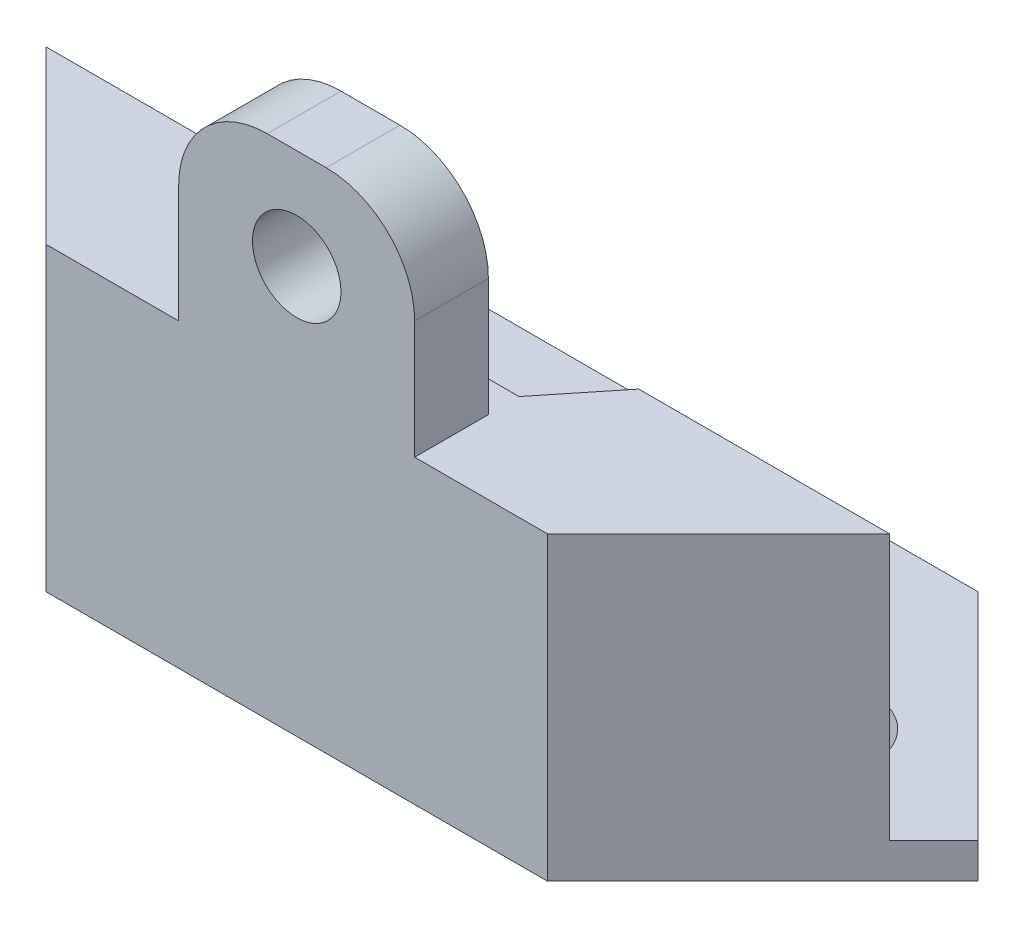
ISO-10303-21;
HEADER;
FILE_DESCRIPTION(('STEP AP214'),'2;1');
FILE_NAME('part.step','',(''),(''),'','','');
FILE_SCHEMA(('AUTOMOTIVE_DESIGN { 1 0 10303 214 1 1 1 1 }'));
ENDSEC;
DATA;
#1=APPLICATION_CONTEXT('core data for automotive mechanical design processes');
#2=APPLICATION_PROTOCOL_DEFINITION('international standard','automotive_design',2000,#1);
#3=PRODUCT_CONTEXT('',#1,'mechanical');
#4=PRODUCT('Part','Part','',(#3));
#5=PRODUCT_RELATED_PRODUCT_CATEGORY('part','',(#4));
#6=PRODUCT_DEFINITION_FORMATION('','',#4);
#7=PRODUCT_DEFINITION_CONTEXT('part definition',#1,'design');
#8=PRODUCT_DEFINITION('design','',#6,#7);
#9=PRODUCT_DEFINITION_SHAPE('','',#8);
#10=(LENGTH_UNIT() NAMED_UNIT(*) SI_UNIT(.MILLI.,.METRE.));
#11=(NAMED_UNIT(*) PLANE_ANGLE_UNIT() SI_UNIT($,.RADIAN.));
#12=(NAMED_UNIT(*) SI_UNIT($,.STERADIAN.) SOLID_ANGLE_UNIT());
#13=UNCERTAINTY_MEASURE_WITH_UNIT(LENGTH_MEASURE(1.E-05),#10,'distance_accuracy_value','');
#14=(GEOMETRIC_REPRESENTATION_CONTEXT(3) GLOBAL_UNCERTAINTY_ASSIGNED_CONTEXT((#13)) GLOBAL_UNIT_ASSIGNED_CONTEXT((#10,
#11,#12)) REPRESENTATION_CONTEXT('',''));
#15=CARTESIAN_POINT('',(0.,0.,0.));
#16=DIRECTION('',(0.,0.,1.));
#17=DIRECTION('',(1.,0.,0.));
#18=AXIS2_PLACEMENT_3D('',#15,#16,#17);
#19=CARTESIAN_POINT('',(-0.999999999999999,14.2,4.8));
#20=DIRECTION('',(0.,0.,1.));
#21=DIRECTION('',(1.,0.,0.));
#22=AXIS2_PLACEMENT_3D('',#19,#20,#21);
#23=CYLINDRICAL_SURFACE('',#22,3.);
#24=DIRECTION('',(0.,0.,-1.));
#25=VECTOR('',#24,1.);
#26=CARTESIAN_POINT('',(-4.,14.2,4.8));
#27=LINE('',#26,#25);
#28=CARTESIAN_POINT('',(-4.,14.2,7.3));
#29=VERTEX_POINT('',#28);
#30=CARTESIAN_POINT('',(-4.,14.2,4.8));
#31=VERTEX_POINT('',#30);
#32=EDGE_CURVE('E336',#29,#31,#27,.T.);
#33=ORIENTED_EDGE('',*,*,#32,.F.);
#34=CARTESIAN_POINT('',(-0.999999999999999,14.2,7.3));
#35=DIRECTION('',(0.,0.,-1.));
#36=DIRECTION('',(-1.,0.,0.));
#37=AXIS2_PLACEMENT_3D('',#34,#35,#36);
#38=CIRCLE('',#37,3.);
#39=CARTESIAN_POINT('',(-0.999999999999999,17.2,7.3));
#40=VERTEX_POINT('',#39);
#41=EDGE_CURVE('E41',#40,#29,#38,.F.);
#42=ORIENTED_EDGE('',*,*,#41,.F.);
#43=DIRECTION('',(0.,0.,-1.));
#44=VECTOR('',#43,1.);
#45=CARTESIAN_POINT('',(-0.999999999999999,17.2,4.8));
#46=LINE('',#45,#44);
#47=CARTESIAN_POINT('',(-0.999999999999999,17.2,4.8));
#48=VERTEX_POINT('',#47);
#49=EDGE_CURVE('E339',#48,#40,#46,.F.);
#50=ORIENTED_EDGE('',*,*,#49,.F.);
#51=CARTESIAN_POINT('',(-0.999999999999999,14.2,4.8));
#52=DIRECTION('',(0.,0.,1.));
#53=DIRECTION('',(1.,0.,0.));
#54=AXIS2_PLACEMENT_3D('',#51,#52,#53);
#55=CIRCLE('',#54,3.);
#56=EDGE_CURVE('E11',#31,#48,#55,.F.);
#57=ORIENTED_EDGE('',*,*,#56,.F.);
#58=EDGE_LOOP('',(#33,#42,#50,#57));
#59=FACE_BOUND('',#58,.T.);
#60=ADVANCED_FACE('F34',(#59),#23,.T.);
#61=CARTESIAN_POINT('',(1.,14.2,4.8));
#62=DIRECTION('',(0.,0.,-1.));
#63=DIRECTION('',(-1.,0.,0.));
#64=AXIS2_PLACEMENT_3D('',#61,#62,#63);
#65=CYLINDRICAL_SURFACE('',#64,3.);
#66=DIRECTION('',(0.,0.,1.));
#67=VECTOR('',#66,1.);
#68=CARTESIAN_POINT('',(4.,14.2,4.8));
#69=LINE('',#68,#67);
#70=CARTESIAN_POINT('',(4.,14.2,4.8));
#71=VERTEX_POINT('',#70);
#72=CARTESIAN_POINT('',(4.,14.2,7.3));
#73=VERTEX_POINT('',#72);
#74=EDGE_CURVE('E324',#71,#73,#69,.T.);
#75=ORIENTED_EDGE('',*,*,#74,.F.);
#76=CARTESIAN_POINT('',(1.,14.2,4.8));
#77=DIRECTION('',(0.,0.,1.));
#78=DIRECTION('',(1.,0.,0.));
#79=AXIS2_PLACEMENT_3D('',#76,#77,#78);
#80=CIRCLE('',#79,3.);
#81=CARTESIAN_POINT('',(1.,17.2,4.8));
#82=VERTEX_POINT('',#81);
#83=EDGE_CURVE('E331',#82,#71,#80,.F.);
#84=ORIENTED_EDGE('',*,*,#83,.F.);
#85=DIRECTION('',(0.,0.,1.));
#86=VECTOR('',#85,1.);
#87=CARTESIAN_POINT('',(1.,17.2,4.8));
#88=LINE('',#87,#86);
#89=CARTESIAN_POINT('',(1.,17.2,7.3));
#90=VERTEX_POINT('',#89);
#91=EDGE_CURVE('E327',#90,#82,#88,.F.);
#92=ORIENTED_EDGE('',*,*,#91,.F.);
#93=CARTESIAN_POINT('',(1.,14.2,7.3));
#94=DIRECTION('',(0.,0.,-1.));
#95=DIRECTION('',(-1.,0.,0.));
#96=AXIS2_PLACEMENT_3D('',#93,#94,#95);
#97=CIRCLE('',#96,3.);
#98=EDGE_CURVE('E333',#73,#90,#97,.F.);
#99=ORIENTED_EDGE('',*,*,#98,.F.);
#100=EDGE_LOOP('',(#75,#84,#92,#99));
#101=FACE_BOUND('',#100,.T.);
#102=ADVANCED_FACE('F404',(#101),#65,.T.);
#103=CARTESIAN_POINT('',(-14.3000000000001,10.2,1.5));
#104=DIRECTION('',(0.,0.,1.));
#105=DIRECTION('',(1.,0.,0.));
#106=AXIS2_PLACEMENT_3D('',#103,#104,#105);
#107=PLANE('',#106);
#108=CARTESIAN_POINT('',(-9.75000000000006,6.7,1.5));
#109=DIRECTION('',(0.,0.,-1.));
#110=DIRECTION('',(-1.,0.,0.));
#111=AXIS2_PLACEMENT_3D('',#108,#109,#110);
#112=CIRCLE('',#111,1.15);
#113=CARTESIAN_POINT('',(-10.9000000000001,6.7,1.5));
#114=VERTEX_POINT('',#113);
#115=EDGE_CURVE('E227',#114,#114,#112,.T.);
#116=ORIENTED_EDGE('',*,*,#115,.F.);
#117=EDGE_LOOP('',(#116));
#118=FACE_BOUND('',#117,.T.);
#119=DIRECTION('',(-1.,0.,0.));
#120=VECTOR('',#119,1.);
#121=CARTESIAN_POINT('',(-14.3000000000001,10.2,1.5));
#122=LINE('',#121,#120);
#123=CARTESIAN_POINT('',(-5.80000000000006,10.2,1.5));
#124=VERTEX_POINT('',#123);
#125=CARTESIAN_POINT('',(-14.3000000000001,10.2,1.5));
#126=VERTEX_POINT('',#125);
#127=EDGE_CURVE('E249',#124,#126,#122,.T.);
#128=ORIENTED_EDGE('',*,*,#127,.F.);
#129=DIRECTION('',(0.,1.,0.));
#130=VECTOR('',#129,1.);
#131=CARTESIAN_POINT('',(-5.80000000000006,1.2,1.5));
#132=LINE('',#131,#130);
#133=CARTESIAN_POINT('',(-5.80000000000006,1.2,1.5));
#134=VERTEX_POINT('',#133);
#135=EDGE_CURVE('E197',#134,#124,#132,.T.);
#136=ORIENTED_EDGE('',*,*,#135,.F.);
#137=DIRECTION('',(-1.,0.,0.));
#138=VECTOR('',#137,1.);
#139=CARTESIAN_POINT('',(-14.3000000000001,1.2,1.5));
#140=LINE('',#139,#138);
#141=CARTESIAN_POINT('',(-9.75,1.2,1.5));
#142=VERTEX_POINT('',#141);
#143=EDGE_CURVE('E256',#134,#142,#140,.T.);
#144=ORIENTED_EDGE('',*,*,#143,.T.);
#145=CARTESIAN_POINT('',(-14.3000000000001,1.2,1.5));
#146=VERTEX_POINT('',#145);
#147=EDGE_CURVE('E257',#142,#146,#140,.T.);
#148=ORIENTED_EDGE('',*,*,#147,.T.);
#149=DIRECTION('',(0.,-1.,0.));
#150=VECTOR('',#149,1.);
#151=CARTESIAN_POINT('',(-14.3000000000001,10.2,1.5));
#152=LINE('',#151,#150);
#153=EDGE_CURVE('E253',#126,#146,#152,.T.);
#154=ORIENTED_EDGE('',*,*,#153,.F.);
#155=EDGE_LOOP('',(#128,#136,#144,#148,#154));
#156=FACE_BOUND('',#155,.T.);
#157=ADVANCED_FACE('F376',(#118,#156),#107,.F.);
#158=CARTESIAN_POINT('',(0.,1.2,7.3));
#159=DIRECTION('',(0.,0.,-1.));
#160=DIRECTION('',(-1.,0.,0.));
#161=AXIS2_PLACEMENT_3D('',#158,#159,#160);
#162=PLANE('',#161);
#163=CARTESIAN_POINT('',(0.,13.8,7.3));
#164=DIRECTION('',(0.,0.,-1.));
#165=DIRECTION('',(-1.,0.,0.));
#166=AXIS2_PLACEMENT_3D('',#163,#164,#165);
#167=CIRCLE('',#166,1.5);
#168=CARTESIAN_POINT('',(-1.5,13.8,7.3));
#169=VERTEX_POINT('',#168);
#170=EDGE_CURVE('E202',#169,#169,#167,.T.);
#171=ORIENTED_EDGE('',*,*,#170,.T.);
#172=EDGE_LOOP('',(#171));
#173=FACE_BOUND('',#172,.T.);
#174=DIRECTION('',(1.,0.,0.));
#175=VECTOR('',#174,1.);
#176=CARTESIAN_POINT('',(-4.,17.2,7.3));
#177=LINE('',#176,#175);
#178=EDGE_CURVE('E206',#40,#90,#177,.T.);
#179=ORIENTED_EDGE('',*,*,#178,.F.);
#180=ORIENTED_EDGE('',*,*,#41,.T.);
#181=DIRECTION('',(0.,-1.,0.));
#182=VECTOR('',#181,1.);
#183=CARTESIAN_POINT('',(-4.,17.2,7.3));
#184=LINE('',#183,#182);
#185=CARTESIAN_POINT('',(-4.,10.2,7.3));
#186=VERTEX_POINT('',#185);
#187=EDGE_CURVE('E225',#29,#186,#184,.T.);
#188=ORIENTED_EDGE('',*,*,#187,.T.);
#189=DIRECTION('',(1.,0.,0.));
#190=VECTOR('',#189,1.);
#191=CARTESIAN_POINT('',(8.5,10.2,7.3));
#192=LINE('',#191,#190);
#193=CARTESIAN_POINT('',(-8.5,10.2,7.3));
#194=VERTEX_POINT('',#193);
#195=EDGE_CURVE('E244',#194,#186,#192,.T.);
#196=ORIENTED_EDGE('',*,*,#195,.F.);
#197=DIRECTION('',(0.,-1.,0.));
#198=VECTOR('',#197,1.);
#199=CARTESIAN_POINT('',(-8.5,1.2,7.3));
#200=LINE('',#199,#198);
#201=CARTESIAN_POINT('',(-8.5,0.,7.3));
#202=VERTEX_POINT('',#201);
#203=EDGE_CURVE('E295',#194,#202,#200,.T.);
#204=ORIENTED_EDGE('',*,*,#203,.T.);
#205=DIRECTION('',(1.,0.,0.));
#206=VECTOR('',#205,1.);
#207=CARTESIAN_POINT('',(0.,0.,7.3));
#208=LINE('',#207,#206);
#209=CARTESIAN_POINT('',(8.5,0.,7.3));
#210=VERTEX_POINT('',#209);
#211=EDGE_CURVE('E279',#202,#210,#208,.T.);
#212=ORIENTED_EDGE('',*,*,#211,.T.);
#213=DIRECTION('',(0.,-1.,0.));
#214=VECTOR('',#213,1.);
#215=CARTESIAN_POINT('',(8.5,1.2,7.3));
#216=LINE('',#215,#214);
#217=CARTESIAN_POINT('',(8.5,10.2,7.3));
#218=VERTEX_POINT('',#217);
#219=EDGE_CURVE('E321',#218,#210,#216,.T.);
#220=ORIENTED_EDGE('',*,*,#219,.F.);
#221=CARTESIAN_POINT('',(4.,10.2,7.3));
#222=VERTEX_POINT('',#221);
#223=EDGE_CURVE('E243',#222,#218,#192,.T.);
#224=ORIENTED_EDGE('',*,*,#223,.F.);
#225=DIRECTION('',(0.,-1.,0.));
#226=VECTOR('',#225,1.);
#227=CARTESIAN_POINT('',(4.,17.2,7.3));
#228=LINE('',#227,#226);
#229=EDGE_CURVE('E223',#73,#222,#228,.T.);
#230=ORIENTED_EDGE('',*,*,#229,.F.);
#231=ORIENTED_EDGE('',*,*,#98,.T.);
#232=EDGE_LOOP('',(#179,#180,#188,#196,#204,#212,#220,#224,#230,#231));
#233=FACE_BOUND('',#232,.T.);
#234=ADVANCED_FACE('F342',(#173,#233),#162,.F.);
#235=CARTESIAN_POINT('',(7.89999999999996,1.2,7.90000000000004));
#236=DIRECTION('',(-0.707106781186544,0.,-0.707106781186551));
#237=DIRECTION('',(-0.707106781186551,0.,0.707106781186544));
#238=AXIS2_PLACEMENT_3D('',#235,#236,#237);
#239=PLANE('',#238);
#240=DIRECTION('',(0.707106781186551,0.,-0.707106781186544));
#241=VECTOR('',#240,1.);
#242=CARTESIAN_POINT('',(7.89999999999996,0.,7.90000000000004));
#243=LINE('',#242,#241);
#244=CARTESIAN_POINT('',(15.8000000000001,0.,0.));
#245=VERTEX_POINT('',#244);
#246=EDGE_CURVE('E298',#210,#245,#243,.T.);
#247=ORIENTED_EDGE('',*,*,#246,.T.);
#248=DIRECTION('',(0.,-1.,0.));
#249=VECTOR('',#248,1.);
#250=CARTESIAN_POINT('',(15.8000000000001,1.2,0.));
#251=LINE('',#250,#249);
#252=CARTESIAN_POINT('',(15.8000000000001,1.2,0.));
#253=VERTEX_POINT('',#252);
#254=EDGE_CURVE('E318',#253,#245,#251,.T.);
#255=ORIENTED_EDGE('',*,*,#254,.F.);
#256=DIRECTION('',(0.707106781186551,0.,-0.707106781186544));
#257=VECTOR('',#256,1.);
#258=CARTESIAN_POINT('',(7.89999999999996,1.2,7.90000000000004));
#259=LINE('',#258,#257);
#260=CARTESIAN_POINT('',(14.3,1.2,1.5));
#261=VERTEX_POINT('',#260);
#262=EDGE_CURVE('E282',#261,#253,#259,.T.);
#263=ORIENTED_EDGE('',*,*,#262,.F.);
#264=DIRECTION('',(0.,-1.,0.));
#265=VECTOR('',#264,1.);
#266=CARTESIAN_POINT('',(14.3000000000001,10.2,1.5));
#267=LINE('',#266,#265);
#268=CARTESIAN_POINT('',(14.3000000000001,10.2,1.5));
#269=VERTEX_POINT('',#268);
#270=EDGE_CURVE('E260',#269,#261,#267,.T.);
#271=ORIENTED_EDGE('',*,*,#270,.F.);
#272=DIRECTION('',(0.707106781186551,0.,-0.707106781186544));
#273=VECTOR('',#272,1.);
#274=CARTESIAN_POINT('',(14.3000000000001,10.2,1.5));
#275=LINE('',#274,#273);
#276=EDGE_CURVE('E247',#218,#269,#275,.T.);
#277=ORIENTED_EDGE('',*,*,#276,.F.);
#278=ORIENTED_EDGE('',*,*,#219,.T.);
#279=EDGE_LOOP('',(#247,#255,#263,#271,#277,#278));
#280=FACE_BOUND('',#279,.T.);
#281=ADVANCED_FACE('F365',(#280),#239,.F.);
#282=CARTESIAN_POINT('',(7.89999999999996,1.2,-7.90000000000004));
#283=DIRECTION('',(-0.707106781186544,0.,0.707106781186551));
#284=DIRECTION('',(0.707106781186551,0.,0.707106781186544));
#285=AXIS2_PLACEMENT_3D('',#282,#283,#284);
#286=PLANE('',#285);
#287=DIRECTION('',(-0.707106781186551,0.,-0.707106781186544));
#288=VECTOR('',#287,1.);
#289=CARTESIAN_POINT('',(7.89999999999996,0.,-7.90000000000004));
#290=LINE('',#289,#288);
#291=CARTESIAN_POINT('',(8.5,0.,-7.3));
#292=VERTEX_POINT('',#291);
#293=EDGE_CURVE('E300',#245,#292,#290,.T.);
#294=ORIENTED_EDGE('',*,*,#293,.T.);
#295=DIRECTION('',(0.,-1.,0.));
#296=VECTOR('',#295,1.);
#297=CARTESIAN_POINT('',(8.5,1.2,-7.3));
#298=LINE('',#297,#296);
#299=CARTESIAN_POINT('',(8.5,1.2,-7.3));
#300=VERTEX_POINT('',#299);
#301=EDGE_CURVE('E316',#300,#292,#298,.T.);
#302=ORIENTED_EDGE('',*,*,#301,.F.);
#303=DIRECTION('',(-0.707106781186551,0.,-0.707106781186544));
#304=VECTOR('',#303,1.);
#305=CARTESIAN_POINT('',(7.89999999999996,1.2,-7.90000000000004));
#306=LINE('',#305,#304);
#307=EDGE_CURVE('E284',#253,#300,#306,.T.);
#308=ORIENTED_EDGE('',*,*,#307,.F.);
#309=ORIENTED_EDGE('',*,*,#254,.T.);
#310=EDGE_LOOP('',(#294,#302,#308,#309));
#311=FACE_BOUND('',#310,.T.);
#312=ADVANCED_FACE('F420',(#311),#286,.F.);
#313=CARTESIAN_POINT('',(0.,1.2,-7.3));
#314=DIRECTION('',(0.,0.,-1.));
#315=DIRECTION('',(-1.,0.,0.));
#316=AXIS2_PLACEMENT_3D('',#313,#314,#315);
#317=PLANE('',#316);
#318=DIRECTION('',(1.,0.,0.));
#319=VECTOR('',#318,1.);
#320=CARTESIAN_POINT('',(0.,0.,-7.3));
#321=LINE('',#320,#319);
#322=CARTESIAN_POINT('',(-8.5,0.,-7.3));
#323=VERTEX_POINT('',#322);
#324=EDGE_CURVE('E303',#323,#292,#321,.T.);
#325=ORIENTED_EDGE('',*,*,#324,.F.);
#326=DIRECTION('',(0.,-1.,0.));
#327=VECTOR('',#326,1.);
#328=CARTESIAN_POINT('',(-8.5,1.2,-7.3));
#329=LINE('',#328,#327);
#330=CARTESIAN_POINT('',(-8.5,1.2,-7.3));
#331=VERTEX_POINT('',#330);
#332=EDGE_CURVE('E314',#331,#323,#329,.T.);
#333=ORIENTED_EDGE('',*,*,#332,.F.);
#334=DIRECTION('',(1.,0.,0.));
#335=VECTOR('',#334,1.);
#336=CARTESIAN_POINT('',(0.,1.2,-7.3));
#337=LINE('',#336,#335);
#338=EDGE_CURVE('E287',#331,#300,#337,.T.);
#339=ORIENTED_EDGE('',*,*,#338,.T.);
#340=ORIENTED_EDGE('',*,*,#301,.T.);
#341=EDGE_LOOP('',(#325,#333,#339,#340));
#342=FACE_BOUND('',#341,.T.);
#343=ADVANCED_FACE('F423',(#342),#317,.T.);
#344=CARTESIAN_POINT('',(-7.89999999999996,1.2,-7.90000000000004));
#345=DIRECTION('',(-0.707106781186544,0.,-0.707106781186551));
#346=DIRECTION('',(-0.707106781186551,0.,0.707106781186544));
#347=AXIS2_PLACEMENT_3D('',#344,#345,#346);
#348=PLANE('',#347);
#349=DIRECTION('',(0.707106781186551,0.,-0.707106781186544));
#350=VECTOR('',#349,1.);
#351=CARTESIAN_POINT('',(-7.89999999999996,0.,-7.90000000000004));
#352=LINE('',#351,#350);
#353=CARTESIAN_POINT('',(-15.8000000000001,0.,0.));
#354=VERTEX_POINT('',#353);
#355=EDGE_CURVE('E306',#354,#323,#352,.T.);
#356=ORIENTED_EDGE('',*,*,#355,.F.);
#357=DIRECTION('',(0.,-1.,0.));
#358=VECTOR('',#357,1.);
#359=CARTESIAN_POINT('',(-15.8000000000001,1.2,0.));
#360=LINE('',#359,#358);
#361=CARTESIAN_POINT('',(-15.8000000000001,1.2,0.));
#362=VERTEX_POINT('',#361);
#363=EDGE_CURVE('E312',#362,#354,#360,.T.);
#364=ORIENTED_EDGE('',*,*,#363,.F.);
#365=DIRECTION('',(0.707106781186551,0.,-0.707106781186544));
#366=VECTOR('',#365,1.);
#367=CARTESIAN_POINT('',(-7.89999999999996,1.2,-7.90000000000004));
#368=LINE('',#367,#366);
#369=EDGE_CURVE('E290',#362,#331,#368,.T.);
#370=ORIENTED_EDGE('',*,*,#369,.T.);
#371=ORIENTED_EDGE('',*,*,#332,.T.);
#372=EDGE_LOOP('',(#356,#364,#370,#371));
#373=FACE_BOUND('',#372,.T.);
#374=ADVANCED_FACE('F427',(#373),#348,.T.);
#375=CARTESIAN_POINT('',(-7.89999999999996,1.2,7.90000000000004));
#376=DIRECTION('',(-0.707106781186544,0.,0.707106781186551));
#377=DIRECTION('',(0.707106781186551,0.,0.707106781186544));
#378=AXIS2_PLACEMENT_3D('',#375,#376,#377);
#379=PLANE('',#378);
#380=DIRECTION('',(-0.707106781186551,0.,-0.707106781186544));
#381=VECTOR('',#380,1.);
#382=CARTESIAN_POINT('',(-7.89999999999996,0.,7.90000000000004));
#383=LINE('',#382,#381);
#384=EDGE_CURVE('E285',#202,#354,#383,.T.);
#385=ORIENTED_EDGE('',*,*,#384,.F.);
#386=ORIENTED_EDGE('',*,*,#203,.F.);
#387=DIRECTION('',(0.707106781186551,0.,0.707106781186544));
#388=VECTOR('',#387,1.);
#389=CARTESIAN_POINT('',(-8.5,10.2,7.3));
#390=LINE('',#389,#388);
#391=EDGE_CURVE('E240',#126,#194,#390,.T.);
#392=ORIENTED_EDGE('',*,*,#391,.F.);
#393=ORIENTED_EDGE('',*,*,#153,.T.);
#394=DIRECTION('',(-0.707106781186551,0.,-0.707106781186544));
#395=VECTOR('',#394,1.);
#396=CARTESIAN_POINT('',(-7.89999999999996,1.2,7.90000000000004));
#397=LINE('',#396,#395);
#398=EDGE_CURVE('E293',#146,#362,#397,.T.);
#399=ORIENTED_EDGE('',*,*,#398,.T.);
#400=ORIENTED_EDGE('',*,*,#363,.T.);
#401=EDGE_LOOP('',(#385,#386,#392,#393,#399,#400));
#402=FACE_BOUND('',#401,.T.);
#403=ADVANCED_FACE('F382',(#402),#379,.T.);
#404=CARTESIAN_POINT('',(0.,1.2,0.));
#405=DIRECTION('',(0.,1.,0.));
#406=DIRECTION('',(0.,0.,1.));
#407=AXIS2_PLACEMENT_3D('',#404,#405,#406);
#408=PLANE('',#407);
#409=CARTESIAN_POINT('',(9.75,1.2,1.5));
#410=VERTEX_POINT('',#409);
#411=EDGE_CURVE('E237',#261,#410,#140,.T.);
#412=ORIENTED_EDGE('',*,*,#411,.F.);
#413=ORIENTED_EDGE('',*,*,#262,.T.);
#414=ORIENTED_EDGE('',*,*,#307,.T.);
#415=ORIENTED_EDGE('',*,*,#338,.F.);
#416=ORIENTED_EDGE('',*,*,#369,.F.);
#417=ORIENTED_EDGE('',*,*,#398,.F.);
#418=ORIENTED_EDGE('',*,*,#147,.F.);
#419=CARTESIAN_POINT('',(-9.75,1.2,-0.5));
#420=DIRECTION('',(0.,1.,0.));
#421=DIRECTION('',(0.,0.,1.));
#422=AXIS2_PLACEMENT_3D('',#419,#420,#421);
#423=CIRCLE('',#422,2.);
#424=EDGE_CURVE('E267',#142,#142,#423,.T.);
#425=ORIENTED_EDGE('',*,*,#424,.F.);
#426=ORIENTED_EDGE('',*,*,#143,.F.);
#427=DIRECTION('',(0.633510906252051,0.,0.77373376019126));
#428=VECTOR('',#427,1.);
#429=CARTESIAN_POINT('',(-3.95776483797899,1.2,3.75));
#430=LINE('',#429,#428);
#431=CARTESIAN_POINT('',(-3.95776483797899,1.2,3.75));
#432=VERTEX_POINT('',#431);
#433=EDGE_CURVE('E173',#134,#432,#430,.T.);
#434=ORIENTED_EDGE('',*,*,#433,.T.);
#435=DIRECTION('',(1.,0.,0.));
#436=VECTOR('',#435,1.);
#437=CARTESIAN_POINT('',(-3.95776483797899,1.2,3.75));
#438=LINE('',#437,#436);
#439=CARTESIAN_POINT('',(3.98902582007535,1.2,3.75));
#440=VERTEX_POINT('',#439);
#441=EDGE_CURVE('E166',#432,#440,#438,.T.);
#442=ORIENTED_EDGE('',*,*,#441,.T.);
#443=DIRECTION('',(0.627009104787753,0.,-0.779011927067398));
#444=VECTOR('',#443,1.);
#445=CARTESIAN_POINT('',(3.98902582007535,1.2,3.75));
#446=LINE('',#445,#444);
#447=CARTESIAN_POINT('',(5.80000000000006,1.2,1.5));
#448=VERTEX_POINT('',#447);
#449=EDGE_CURVE('E176',#440,#448,#446,.T.);
#450=ORIENTED_EDGE('',*,*,#449,.T.);
#451=EDGE_CURVE('E328',#410,#448,#140,.T.);
#452=ORIENTED_EDGE('',*,*,#451,.F.);
#453=CARTESIAN_POINT('',(9.75,1.2,-0.500000000000008));
#454=DIRECTION('',(0.,1.,0.));
#455=DIRECTION('',(0.,0.,1.));
#456=AXIS2_PLACEMENT_3D('',#453,#454,#455);
#457=CIRCLE('',#456,2.);
#458=EDGE_CURVE('E263',#410,#410,#457,.T.);
#459=ORIENTED_EDGE('',*,*,#458,.F.);
#460=EDGE_LOOP('',(#412,#413,#414,#415,#416,#417,#418,#425,#426,#434,#442,#450,#452,#459));
#461=FACE_BOUND('',#460,.T.);
#462=CARTESIAN_POINT('',(0.,1.2,-3.5));
#463=DIRECTION('',(0.,1.,0.));
#464=DIRECTION('',(0.,0.,1.));
#465=AXIS2_PLACEMENT_3D('',#462,#463,#464);
#466=CIRCLE('',#465,2.05488215161963);
#467=CARTESIAN_POINT('',(0.,1.2,-1.44511784838037));
#468=VERTEX_POINT('',#467);
#469=EDGE_CURVE('E268',#468,#468,#466,.T.);
#470=ORIENTED_EDGE('',*,*,#469,.F.);
#471=EDGE_LOOP('',(#470));
#472=FACE_BOUND('',#471,.T.);
#473=ADVANCED_FACE('F182',(#461,#472),#408,.T.);
#474=CARTESIAN_POINT('',(0.,0.,0.));
#475=DIRECTION('',(0.,1.,0.));
#476=DIRECTION('',(0.,0.,1.));
#477=AXIS2_PLACEMENT_3D('',#474,#475,#476);
#478=PLANE('',#477);
#479=CARTESIAN_POINT('',(0.,0.,-3.5));
#480=DIRECTION('',(0.,1.,0.));
#481=DIRECTION('',(0.,0.,1.));
#482=AXIS2_PLACEMENT_3D('',#479,#480,#481);
#483=CIRCLE('',#482,2.05488215161963);
#484=CARTESIAN_POINT('',(0.,0.,-1.44511784838037));
#485=VERTEX_POINT('',#484);
#486=EDGE_CURVE('E264',#485,#485,#483,.T.);
#487=ORIENTED_EDGE('',*,*,#486,.T.);
#488=EDGE_LOOP('',(#487));
#489=FACE_BOUND('',#488,.T.);
#490=CARTESIAN_POINT('',(9.75,0.,-0.500000000000008));
#491=DIRECTION('',(0.,1.,0.));
#492=DIRECTION('',(0.,0.,1.));
#493=AXIS2_PLACEMENT_3D('',#490,#491,#492);
#494=CIRCLE('',#493,2.);
#495=CARTESIAN_POINT('',(9.75,0.,1.49999999999999));
#496=VERTEX_POINT('',#495);
#497=EDGE_CURVE('E271',#496,#496,#494,.T.);
#498=ORIENTED_EDGE('',*,*,#497,.T.);
#499=EDGE_LOOP('',(#498));
#500=FACE_BOUND('',#499,.T.);
#501=CARTESIAN_POINT('',(-9.75,0.,-0.5));
#502=DIRECTION('',(0.,1.,0.));
#503=DIRECTION('',(0.,0.,1.));
#504=AXIS2_PLACEMENT_3D('',#501,#502,#503);
#505=CIRCLE('',#504,2.);
#506=CARTESIAN_POINT('',(-9.75,0.,1.5));
#507=VERTEX_POINT('',#506);
#508=EDGE_CURVE('E276',#507,#507,#505,.T.);
#509=ORIENTED_EDGE('',*,*,#508,.T.);
#510=EDGE_LOOP('',(#509));
#511=FACE_BOUND('',#510,.T.);
#512=ORIENTED_EDGE('',*,*,#211,.F.);
#513=ORIENTED_EDGE('',*,*,#384,.T.);
#514=ORIENTED_EDGE('',*,*,#355,.T.);
#515=ORIENTED_EDGE('',*,*,#324,.T.);
#516=ORIENTED_EDGE('',*,*,#293,.F.);
#517=ORIENTED_EDGE('',*,*,#246,.F.);
#518=EDGE_LOOP('',(#512,#513,#514,#515,#516,#517));
#519=FACE_BOUND('',#518,.T.);
#520=ADVANCED_FACE('F389',(#489,#500,#511,#519),#478,.F.);
#521=CARTESIAN_POINT('',(-9.75,0.,-0.5));
#522=DIRECTION('',(0.,1.,0.));
#523=DIRECTION('',(0.,0.,1.));
#524=AXIS2_PLACEMENT_3D('',#521,#522,#523);
#525=CYLINDRICAL_SURFACE('',#524,2.);
#526=ORIENTED_EDGE('',*,*,#508,.F.);
#527=EDGE_LOOP('',(#526));
#528=FACE_BOUND('',#527,.T.);
#529=ORIENTED_EDGE('',*,*,#424,.T.);
#530=EDGE_LOOP('',(#529));
#531=FACE_BOUND('',#530,.T.);
#532=ADVANCED_FACE('F386',(#528,#531),#525,.F.);
#533=CARTESIAN_POINT('',(9.75,0.,-0.500000000000008));
#534=DIRECTION('',(0.,1.,0.));
#535=DIRECTION('',(0.,0.,1.));
#536=AXIS2_PLACEMENT_3D('',#533,#534,#535);
#537=CYLINDRICAL_SURFACE('',#536,2.);
#538=ORIENTED_EDGE('',*,*,#497,.F.);
#539=EDGE_LOOP('',(#538));
#540=FACE_BOUND('',#539,.T.);
#541=ORIENTED_EDGE('',*,*,#458,.T.);
#542=EDGE_LOOP('',(#541));
#543=FACE_BOUND('',#542,.T.);
#544=ADVANCED_FACE('F388',(#540,#543),#537,.F.);
#545=CARTESIAN_POINT('',(0.,0.,-3.5));
#546=DIRECTION('',(0.,1.,0.));
#547=DIRECTION('',(0.,0.,1.));
#548=AXIS2_PLACEMENT_3D('',#545,#546,#547);
#549=CYLINDRICAL_SURFACE('',#548,2.05488215161963);
#550=ORIENTED_EDGE('',*,*,#486,.F.);
#551=EDGE_LOOP('',(#550));
#552=FACE_BOUND('',#551,.T.);
#553=ORIENTED_EDGE('',*,*,#469,.T.);
#554=EDGE_LOOP('',(#553));
#555=FACE_BOUND('',#554,.T.);
#556=ADVANCED_FACE('F396',(#552,#555),#549,.F.);
#557=CARTESIAN_POINT('',(9.80000000000006,6.7,1.5));
#558=DIRECTION('',(0.,0.,-1.));
#559=DIRECTION('',(-1.,0.,0.));
#560=AXIS2_PLACEMENT_3D('',#557,#558,#559);
#561=CIRCLE('',#560,1.15);
#562=CARTESIAN_POINT('',(8.65000000000006,6.7,1.5));
#563=VERTEX_POINT('',#562);
#564=EDGE_CURVE('E231',#563,#563,#561,.T.);
#565=ORIENTED_EDGE('',*,*,#564,.F.);
#566=EDGE_LOOP('',(#565));
#567=FACE_BOUND('',#566,.T.);
#568=ORIENTED_EDGE('',*,*,#451,.T.);
#569=DIRECTION('',(0.,1.,0.));
#570=VECTOR('',#569,1.);
#571=CARTESIAN_POINT('',(5.80000000000006,1.2,1.5));
#572=LINE('',#571,#570);
#573=CARTESIAN_POINT('',(5.80000000000006,10.2,1.5));
#574=VERTEX_POINT('',#573);
#575=EDGE_CURVE('E172',#448,#574,#572,.T.);
#576=ORIENTED_EDGE('',*,*,#575,.T.);
#577=EDGE_CURVE('E250',#269,#574,#122,.T.);
#578=ORIENTED_EDGE('',*,*,#577,.F.);
#579=ORIENTED_EDGE('',*,*,#270,.T.);
#580=ORIENTED_EDGE('',*,*,#411,.T.);
#581=EDGE_LOOP('',(#568,#576,#578,#579,#580));
#582=FACE_BOUND('',#581,.T.);
#583=ADVANCED_FACE('F369',(#567,#582),#107,.F.);
#584=CARTESIAN_POINT('',(0.,10.2,0.));
#585=DIRECTION('',(0.,1.,0.));
#586=DIRECTION('',(0.,0.,1.));
#587=AXIS2_PLACEMENT_3D('',#584,#585,#586);
#588=PLANE('',#587);
#589=DIRECTION('',(0.633510906252051,0.,0.77373376019126));
#590=VECTOR('',#589,1.);
#591=CARTESIAN_POINT('',(-3.95776483797899,10.2,3.75));
#592=LINE('',#591,#590);
#593=CARTESIAN_POINT('',(-3.95776483797899,10.2,3.75));
#594=VERTEX_POINT('',#593);
#595=EDGE_CURVE('E185',#124,#594,#592,.T.);
#596=ORIENTED_EDGE('',*,*,#595,.F.);
#597=ORIENTED_EDGE('',*,*,#127,.T.);
#598=ORIENTED_EDGE('',*,*,#391,.T.);
#599=ORIENTED_EDGE('',*,*,#195,.T.);
#600=DIRECTION('',(0.,0.,1.));
#601=VECTOR('',#600,1.);
#602=CARTESIAN_POINT('',(-4.,10.2,4.8));
#603=LINE('',#602,#601);
#604=CARTESIAN_POINT('',(-4.,10.2,4.8));
#605=VERTEX_POINT('',#604);
#606=EDGE_CURVE('E205',#605,#186,#603,.T.);
#607=ORIENTED_EDGE('',*,*,#606,.F.);
#608=DIRECTION('',(-1.,0.,0.));
#609=VECTOR('',#608,1.);
#610=CARTESIAN_POINT('',(-4.,10.2,4.8));
#611=LINE('',#610,#609);
#612=CARTESIAN_POINT('',(4.,10.2,4.8));
#613=VERTEX_POINT('',#612);
#614=EDGE_CURVE('E209',#613,#605,#611,.T.);
#615=ORIENTED_EDGE('',*,*,#614,.F.);
#616=DIRECTION('',(0.,0.,-1.));
#617=VECTOR('',#616,1.);
#618=CARTESIAN_POINT('',(4.,10.2,4.8));
#619=LINE('',#618,#617);
#620=EDGE_CURVE('E215',#222,#613,#619,.T.);
#621=ORIENTED_EDGE('',*,*,#620,.F.);
#622=ORIENTED_EDGE('',*,*,#223,.T.);
#623=ORIENTED_EDGE('',*,*,#276,.T.);
#624=ORIENTED_EDGE('',*,*,#577,.T.);
#625=DIRECTION('',(0.627009104787753,0.,-0.779011927067398));
#626=VECTOR('',#625,1.);
#627=CARTESIAN_POINT('',(3.98902582007535,10.2,3.75));
#628=LINE('',#627,#626);
#629=CARTESIAN_POINT('',(3.98902582007535,10.2,3.75));
#630=VERTEX_POINT('',#629);
#631=EDGE_CURVE('E188',#630,#574,#628,.T.);
#632=ORIENTED_EDGE('',*,*,#631,.F.);
#633=DIRECTION('',(1.,0.,0.));
#634=VECTOR('',#633,1.);
#635=CARTESIAN_POINT('',(-3.95776483797899,10.2,3.75));
#636=LINE('',#635,#634);
#637=EDGE_CURVE('E169',#594,#630,#636,.T.);
#638=ORIENTED_EDGE('',*,*,#637,.F.);
#639=EDGE_LOOP('',(#596,#597,#598,#599,#607,#615,#621,#622,#623,#624,#632,#638));
#640=FACE_BOUND('',#639,.T.);
#641=ADVANCED_FACE('F351',(#640),#588,.T.);
#642=CARTESIAN_POINT('',(9.80000000000006,6.7,4.5));
#643=DIRECTION('',(0.,0.,-1.));
#644=DIRECTION('',(-1.,0.,0.));
#645=AXIS2_PLACEMENT_3D('',#642,#643,#644);
#646=CYLINDRICAL_SURFACE('',#645,1.15);
#647=CARTESIAN_POINT('',(9.80000000000006,6.7,4.5));
#648=DIRECTION('',(0.,0.,-1.));
#649=DIRECTION('',(-1.,0.,0.));
#650=AXIS2_PLACEMENT_3D('',#647,#648,#649);
#651=CIRCLE('',#650,1.15);
#652=CARTESIAN_POINT('',(8.65000000000006,6.7,4.5));
#653=VERTEX_POINT('',#652);
#654=EDGE_CURVE('E234',#653,#653,#651,.T.);
#655=ORIENTED_EDGE('',*,*,#654,.F.);
#656=EDGE_LOOP('',(#655));
#657=FACE_BOUND('',#656,.T.);
#658=ORIENTED_EDGE('',*,*,#564,.T.);
#659=EDGE_LOOP('',(#658));
#660=FACE_BOUND('',#659,.T.);
#661=ADVANCED_FACE('F488',(#657,#660),#646,.F.);
#662=CARTESIAN_POINT('',(9.80000000000006,6.7,4.5));
#663=DIRECTION('',(0.,0.,-1.));
#664=DIRECTION('',(-1.,0.,0.));
#665=AXIS2_PLACEMENT_3D('',#662,#663,#664);
#666=PLANE('',#665);
#667=ORIENTED_EDGE('',*,*,#654,.T.);
#668=EDGE_LOOP('',(#667));
#669=FACE_BOUND('',#668,.T.);
#670=ADVANCED_FACE('F493',(#669),#666,.T.);
#671=CARTESIAN_POINT('',(-9.75000000000006,6.7,4.5));
#672=DIRECTION('',(0.,0.,-1.));
#673=DIRECTION('',(-1.,0.,0.));
#674=AXIS2_PLACEMENT_3D('',#671,#672,#673);
#675=CYLINDRICAL_SURFACE('',#674,1.15);
#676=CARTESIAN_POINT('',(-9.75000000000006,6.7,4.5));
#677=DIRECTION('',(0.,0.,-1.));
#678=DIRECTION('',(-1.,0.,0.));
#679=AXIS2_PLACEMENT_3D('',#676,#677,#678);
#680=CIRCLE('',#679,1.15);
#681=CARTESIAN_POINT('',(-10.9000000000001,6.7,4.5));
#682=VERTEX_POINT('',#681);
#683=EDGE_CURVE('E228',#682,#682,#680,.T.);
#684=ORIENTED_EDGE('',*,*,#683,.F.);
#685=EDGE_LOOP('',(#684));
#686=FACE_BOUND('',#685,.T.);
#687=ORIENTED_EDGE('',*,*,#115,.T.);
#688=EDGE_LOOP('',(#687));
#689=FACE_BOUND('',#688,.T.);
#690=ADVANCED_FACE('F505',(#686,#689),#675,.F.);
#691=CARTESIAN_POINT('',(-9.75000000000006,6.7,4.5));
#692=DIRECTION('',(0.,0.,-1.));
#693=DIRECTION('',(-1.,0.,0.));
#694=AXIS2_PLACEMENT_3D('',#691,#692,#693);
#695=PLANE('',#694);
#696=ORIENTED_EDGE('',*,*,#683,.T.);
#697=EDGE_LOOP('',(#696));
#698=FACE_BOUND('',#697,.T.);
#699=ADVANCED_FACE('F515',(#698),#695,.T.);
#700=CARTESIAN_POINT('',(-4.,17.2,4.8));
#701=DIRECTION('',(1.,0.,0.));
#702=DIRECTION('',(0.,0.,-1.));
#703=AXIS2_PLACEMENT_3D('',#700,#701,#702);
#704=PLANE('',#703);
#705=ORIENTED_EDGE('',*,*,#187,.F.);
#706=ORIENTED_EDGE('',*,*,#32,.T.);
#707=DIRECTION('',(0.,-1.,0.));
#708=VECTOR('',#707,1.);
#709=CARTESIAN_POINT('',(-4.,17.2,4.8));
#710=LINE('',#709,#708);
#711=EDGE_CURVE('E212',#31,#605,#710,.T.);
#712=ORIENTED_EDGE('',*,*,#711,.T.);
#713=ORIENTED_EDGE('',*,*,#606,.T.);
#714=EDGE_LOOP('',(#705,#706,#712,#713));
#715=FACE_BOUND('',#714,.T.);
#716=ADVANCED_FACE('F346',(#715),#704,.F.);
#717=CARTESIAN_POINT('',(4.,17.2,4.8));
#718=DIRECTION('',(-1.,0.,0.));
#719=DIRECTION('',(0.,0.,1.));
#720=AXIS2_PLACEMENT_3D('',#717,#718,#719);
#721=PLANE('',#720);
#722=DIRECTION('',(0.,-1.,0.));
#723=VECTOR('',#722,1.);
#724=CARTESIAN_POINT('',(4.,17.2,4.8));
#725=LINE('',#724,#723);
#726=EDGE_CURVE('E221',#71,#613,#725,.T.);
#727=ORIENTED_EDGE('',*,*,#726,.F.);
#728=ORIENTED_EDGE('',*,*,#74,.T.);
#729=ORIENTED_EDGE('',*,*,#229,.T.);
#730=ORIENTED_EDGE('',*,*,#620,.T.);
#731=EDGE_LOOP('',(#727,#728,#729,#730));
#732=FACE_BOUND('',#731,.T.);
#733=ADVANCED_FACE('F357',(#732),#721,.F.);
#734=CARTESIAN_POINT('',(-4.,17.2,4.8));
#735=DIRECTION('',(0.,0.,1.));
#736=DIRECTION('',(1.,0.,0.));
#737=AXIS2_PLACEMENT_3D('',#734,#735,#736);
#738=PLANE('',#737);
#739=CARTESIAN_POINT('',(0.,13.8,4.8));
#740=DIRECTION('',(0.,0.,-1.));
#741=DIRECTION('',(-1.,0.,0.));
#742=AXIS2_PLACEMENT_3D('',#739,#740,#741);
#743=CIRCLE('',#742,1.5);
#744=CARTESIAN_POINT('',(-1.5,13.8,4.8));
#745=VERTEX_POINT('',#744);
#746=EDGE_CURVE('E196',#745,#745,#743,.T.);
#747=ORIENTED_EDGE('',*,*,#746,.F.);
#748=EDGE_LOOP('',(#747));
#749=FACE_BOUND('',#748,.T.);
#750=ORIENTED_EDGE('',*,*,#711,.F.);
#751=ORIENTED_EDGE('',*,*,#56,.T.);
#752=DIRECTION('',(-1.,0.,0.));
#753=VECTOR('',#752,1.);
#754=CARTESIAN_POINT('',(-4.,17.2,4.8));
#755=LINE('',#754,#753);
#756=EDGE_CURVE('E208',#82,#48,#755,.T.);
#757=ORIENTED_EDGE('',*,*,#756,.F.);
#758=ORIENTED_EDGE('',*,*,#83,.T.);
#759=ORIENTED_EDGE('',*,*,#726,.T.);
#760=ORIENTED_EDGE('',*,*,#614,.T.);
#761=EDGE_LOOP('',(#750,#751,#757,#758,#759,#760));
#762=FACE_BOUND('',#761,.T.);
#763=ADVANCED_FACE('F353',(#749,#762),#738,.F.);
#764=CARTESIAN_POINT('',(0.,17.2,0.));
#765=DIRECTION('',(0.,1.,0.));
#766=DIRECTION('',(0.,0.,1.));
#767=AXIS2_PLACEMENT_3D('',#764,#765,#766);
#768=PLANE('',#767);
#769=ORIENTED_EDGE('',*,*,#756,.T.);
#770=ORIENTED_EDGE('',*,*,#49,.T.);
#771=ORIENTED_EDGE('',*,*,#178,.T.);
#772=ORIENTED_EDGE('',*,*,#91,.T.);
#773=EDGE_LOOP('',(#769,#770,#771,#772));
#774=FACE_BOUND('',#773,.T.);
#775=ADVANCED_FACE('F536',(#774),#768,.T.);
#776=CARTESIAN_POINT('',(0.,13.8,14.8));
#777=DIRECTION('',(0.,0.,-1.));
#778=DIRECTION('',(-1.,0.,0.));
#779=AXIS2_PLACEMENT_3D('',#776,#777,#778);
#780=CYLINDRICAL_SURFACE('',#779,1.5);
#781=ORIENTED_EDGE('',*,*,#746,.T.);
#782=EDGE_LOOP('',(#781));
#783=FACE_BOUND('',#782,.T.);
#784=ORIENTED_EDGE('',*,*,#170,.F.);
#785=EDGE_LOOP('',(#784));
#786=FACE_BOUND('',#785,.T.);
#787=ADVANCED_FACE('F532',(#783,#786),#780,.F.);
#788=CARTESIAN_POINT('',(-3.95776483797899,1.2,3.75));
#789=DIRECTION('',(0.,0.,1.));
#790=DIRECTION('',(1.,0.,0.));
#791=AXIS2_PLACEMENT_3D('',#788,#789,#790);
#792=PLANE('',#791);
#793=ORIENTED_EDGE('',*,*,#637,.T.);
#794=DIRECTION('',(0.,1.,0.));
#795=VECTOR('',#794,1.);
#796=CARTESIAN_POINT('',(3.98902582007535,1.2,3.75));
#797=LINE('',#796,#795);
#798=EDGE_CURVE('E162',#440,#630,#797,.T.);
#799=ORIENTED_EDGE('',*,*,#798,.F.);
#800=ORIENTED_EDGE('',*,*,#441,.F.);
#801=DIRECTION('',(0.,1.,0.));
#802=VECTOR('',#801,1.);
#803=CARTESIAN_POINT('',(-3.95776483797899,1.2,3.75));
#804=LINE('',#803,#802);
#805=EDGE_CURVE('E194',#432,#594,#804,.T.);
#806=ORIENTED_EDGE('',*,*,#805,.T.);
#807=EDGE_LOOP('',(#793,#799,#800,#806));
#808=FACE_BOUND('',#807,.T.);
#809=ADVANCED_FACE('F164',(#808),#792,.F.);
#810=CARTESIAN_POINT('',(-3.95776483797899,1.2,3.75));
#811=DIRECTION('',(-0.773733760191259,0.,0.633510906252051));
#812=DIRECTION('',(0.633510906252051,0.,0.77373376019126));
#813=AXIS2_PLACEMENT_3D('',#810,#811,#812);
#814=PLANE('',#813);
#815=ORIENTED_EDGE('',*,*,#595,.T.);
#816=ORIENTED_EDGE('',*,*,#805,.F.);
#817=ORIENTED_EDGE('',*,*,#433,.F.);
#818=ORIENTED_EDGE('',*,*,#135,.T.);
#819=EDGE_LOOP('',(#815,#816,#817,#818));
#820=FACE_BOUND('',#819,.T.);
#821=ADVANCED_FACE('F600',(#820),#814,.F.);
#822=CARTESIAN_POINT('',(3.98902582007535,1.2,3.75));
#823=DIRECTION('',(0.779011927067398,0.,0.627009104787753));
#824=DIRECTION('',(0.627009104787753,0.,-0.779011927067398));
#825=AXIS2_PLACEMENT_3D('',#822,#823,#824);
#826=PLANE('',#825);
#827=ORIENTED_EDGE('',*,*,#631,.T.);
#828=ORIENTED_EDGE('',*,*,#575,.F.);
#829=ORIENTED_EDGE('',*,*,#449,.F.);
#830=ORIENTED_EDGE('',*,*,#798,.T.);
#831=EDGE_LOOP('',(#827,#828,#829,#830));
#832=FACE_BOUND('',#831,.T.);
#833=ADVANCED_FACE('F177',(#832),#826,.F.);
#834=CLOSED_SHELL('',(#60,#102,#157,#234,#281,#312,#343,#374,#403,#473,#520,#532,#544,#556,#583,
#641,#661,#670,#690,#699,#716,#733,#763,#775,#787,#809,#821,#833));
#835=MANIFOLD_SOLID_BREP('B2',#834);
#836=ADVANCED_BREP_SHAPE_REPRESENTATION('',(#18,#835),#14);
#837=SHAPE_DEFINITION_REPRESENTATION(#9,#836);
ENDSEC;
END-ISO-10303-21;
